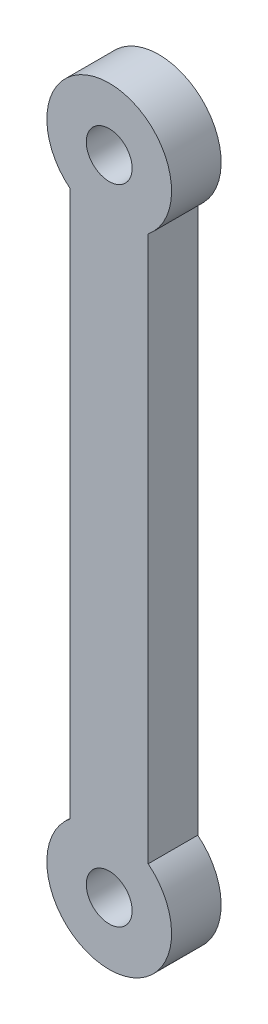
ISO-10303-21;
HEADER;
FILE_DESCRIPTION(('STEP AP214'),'2;1');
FILE_NAME('part.step','',(''),(''),'','','');
FILE_SCHEMA(('AUTOMOTIVE_DESIGN { 1 0 10303 214 1 1 1 1 }'));
ENDSEC;
DATA;
#1=APPLICATION_CONTEXT('core data for automotive mechanical design processes');
#2=APPLICATION_PROTOCOL_DEFINITION('international standard','automotive_design',2000,#1);
#3=PRODUCT_CONTEXT('',#1,'mechanical');
#4=PRODUCT('Part','Part','',(#3));
#5=PRODUCT_RELATED_PRODUCT_CATEGORY('part','',(#4));
#6=PRODUCT_DEFINITION_FORMATION('','',#4);
#7=PRODUCT_DEFINITION_CONTEXT('part definition',#1,'design');
#8=PRODUCT_DEFINITION('design','',#6,#7);
#9=PRODUCT_DEFINITION_SHAPE('','',#8);
#10=(LENGTH_UNIT() NAMED_UNIT(*) SI_UNIT(.MILLI.,.METRE.));
#11=(NAMED_UNIT(*) PLANE_ANGLE_UNIT() SI_UNIT($,.RADIAN.));
#12=(NAMED_UNIT(*) SI_UNIT($,.STERADIAN.) SOLID_ANGLE_UNIT());
#13=UNCERTAINTY_MEASURE_WITH_UNIT(LENGTH_MEASURE(1.E-05),#10,'distance_accuracy_value','');
#14=(GEOMETRIC_REPRESENTATION_CONTEXT(3) GLOBAL_UNCERTAINTY_ASSIGNED_CONTEXT((#13)) GLOBAL_UNIT_ASSIGNED_CONTEXT((#10,
#11,#12)) REPRESENTATION_CONTEXT('',''));
#15=CARTESIAN_POINT('',(0.,0.,0.));
#16=DIRECTION('',(0.,0.,1.));
#17=DIRECTION('',(1.,0.,0.));
#18=AXIS2_PLACEMENT_3D('',#15,#16,#17);
#19=CARTESIAN_POINT('',(2.5,3.1224989991992,3.18));
#20=DIRECTION('',(-1.,0.,0.));
#21=DIRECTION('',(0.,-1.,0.));
#22=AXIS2_PLACEMENT_3D('',#19,#20,#21);
#23=PLANE('',#22);
#24=DIRECTION('',(0.,1.,0.));
#25=VECTOR('',#24,1.);
#26=CARTESIAN_POINT('',(2.5,3.1224989991992,0.));
#27=LINE('',#26,#25);
#28=CARTESIAN_POINT('',(2.5,3.1224989991992,0.));
#29=VERTEX_POINT('',#28);
#30=CARTESIAN_POINT('',(2.5,38.1224989991992,0.));
#31=VERTEX_POINT('',#30);
#32=EDGE_CURVE('E87',#29,#31,#27,.T.);
#33=ORIENTED_EDGE('',*,*,#32,.T.);
#34=DIRECTION('',(0.,0.,-1.));
#35=VECTOR('',#34,1.);
#36=CARTESIAN_POINT('',(2.5,38.1224989991992,3.18));
#37=LINE('',#36,#35);
#38=CARTESIAN_POINT('',(2.5,38.1224989991992,3.18));
#39=VERTEX_POINT('',#38);
#40=EDGE_CURVE('E41',#39,#31,#37,.T.);
#41=ORIENTED_EDGE('',*,*,#40,.F.);
#42=DIRECTION('',(0.,1.,0.));
#43=VECTOR('',#42,1.);
#44=CARTESIAN_POINT('',(2.5,3.1224989991992,3.18));
#45=LINE('',#44,#43);
#46=CARTESIAN_POINT('',(2.5,3.1224989991992,3.18));
#47=VERTEX_POINT('',#46);
#48=EDGE_CURVE('E79',#47,#39,#45,.T.);
#49=ORIENTED_EDGE('',*,*,#48,.F.);
#50=DIRECTION('',(0.,0.,-1.));
#51=VECTOR('',#50,1.);
#52=CARTESIAN_POINT('',(2.5,3.1224989991992,3.18));
#53=LINE('',#52,#51);
#54=EDGE_CURVE('E11',#47,#29,#53,.T.);
#55=ORIENTED_EDGE('',*,*,#54,.T.);
#56=EDGE_LOOP('',(#33,#41,#49,#55));
#57=FACE_BOUND('',#56,.T.);
#58=ADVANCED_FACE('F33',(#57),#23,.F.);
#59=CARTESIAN_POINT('',(0.,41.2449979983984,3.18));
#60=DIRECTION('',(0.,0.,-1.));
#61=DIRECTION('',(-1.,0.,0.));
#62=AXIS2_PLACEMENT_3D('',#59,#60,#61);
#63=CYLINDRICAL_SURFACE('',#62,4.);
#64=CARTESIAN_POINT('',(0.,41.2449979983984,0.));
#65=DIRECTION('',(0.,0.,1.));
#66=DIRECTION('',(1.,0.,0.));
#67=AXIS2_PLACEMENT_3D('',#64,#65,#66);
#68=CIRCLE('',#67,4.);
#69=CARTESIAN_POINT('',(-2.5,38.1224989991992,0.));
#70=VERTEX_POINT('',#69);
#71=EDGE_CURVE('E67',#31,#70,#68,.T.);
#72=ORIENTED_EDGE('',*,*,#71,.T.);
#73=DIRECTION('',(0.,0.,-1.));
#74=VECTOR('',#73,1.);
#75=CARTESIAN_POINT('',(-2.5,38.1224989991992,3.18));
#76=LINE('',#75,#74);
#77=CARTESIAN_POINT('',(-2.5,38.1224989991992,3.18));
#78=VERTEX_POINT('',#77);
#79=EDGE_CURVE('E88',#78,#70,#76,.T.);
#80=ORIENTED_EDGE('',*,*,#79,.F.);
#81=CARTESIAN_POINT('',(0.,41.2449979983984,3.18));
#82=DIRECTION('',(0.,0.,1.));
#83=DIRECTION('',(1.,0.,0.));
#84=AXIS2_PLACEMENT_3D('',#81,#82,#83);
#85=CIRCLE('',#84,4.);
#86=EDGE_CURVE('E83',#39,#78,#85,.T.);
#87=ORIENTED_EDGE('',*,*,#86,.F.);
#88=ORIENTED_EDGE('',*,*,#40,.T.);
#89=EDGE_LOOP('',(#72,#80,#87,#88));
#90=FACE_BOUND('',#89,.T.);
#91=ADVANCED_FACE('F89',(#90),#63,.T.);
#92=CARTESIAN_POINT('',(-2.5,3.1224989991992,3.18));
#93=DIRECTION('',(1.,0.,0.));
#94=DIRECTION('',(0.,1.,0.));
#95=AXIS2_PLACEMENT_3D('',#92,#93,#94);
#96=PLANE('',#95);
#97=DIRECTION('',(0.,-1.,0.));
#98=VECTOR('',#97,1.);
#99=CARTESIAN_POINT('',(-2.5,3.1224989991992,0.));
#100=LINE('',#99,#98);
#101=CARTESIAN_POINT('',(-2.5,3.1224989991992,0.));
#102=VERTEX_POINT('',#101);
#103=EDGE_CURVE('E74',#70,#102,#100,.T.);
#104=ORIENTED_EDGE('',*,*,#103,.T.);
#105=DIRECTION('',(0.,0.,-1.));
#106=VECTOR('',#105,1.);
#107=CARTESIAN_POINT('',(-2.5,3.1224989991992,3.18));
#108=LINE('',#107,#106);
#109=CARTESIAN_POINT('',(-2.5,3.1224989991992,3.18));
#110=VERTEX_POINT('',#109);
#111=EDGE_CURVE('E93',#110,#102,#108,.T.);
#112=ORIENTED_EDGE('',*,*,#111,.F.);
#113=DIRECTION('',(0.,-1.,0.));
#114=VECTOR('',#113,1.);
#115=CARTESIAN_POINT('',(-2.5,3.1224989991992,3.18));
#116=LINE('',#115,#114);
#117=EDGE_CURVE('E91',#78,#110,#116,.T.);
#118=ORIENTED_EDGE('',*,*,#117,.F.);
#119=ORIENTED_EDGE('',*,*,#79,.T.);
#120=EDGE_LOOP('',(#104,#112,#118,#119));
#121=FACE_BOUND('',#120,.T.);
#122=ADVANCED_FACE('F104',(#121),#96,.F.);
#123=CARTESIAN_POINT('',(0.,0.,3.18));
#124=DIRECTION('',(0.,0.,-1.));
#125=DIRECTION('',(-1.,0.,0.));
#126=AXIS2_PLACEMENT_3D('',#123,#124,#125);
#127=CYLINDRICAL_SURFACE('',#126,4.);
#128=CARTESIAN_POINT('',(0.,0.,0.));
#129=DIRECTION('',(0.,0.,1.));
#130=DIRECTION('',(1.,0.,0.));
#131=AXIS2_PLACEMENT_3D('',#128,#129,#130);
#132=CIRCLE('',#131,4.);
#133=EDGE_CURVE('E101',#102,#29,#132,.T.);
#134=ORIENTED_EDGE('',*,*,#133,.T.);
#135=ORIENTED_EDGE('',*,*,#54,.F.);
#136=CARTESIAN_POINT('',(0.,0.,3.18));
#137=DIRECTION('',(0.,0.,1.));
#138=DIRECTION('',(1.,0.,0.));
#139=AXIS2_PLACEMENT_3D('',#136,#137,#138);
#140=CIRCLE('',#139,4.);
#141=EDGE_CURVE('E49',#110,#47,#140,.T.);
#142=ORIENTED_EDGE('',*,*,#141,.F.);
#143=ORIENTED_EDGE('',*,*,#111,.T.);
#144=EDGE_LOOP('',(#134,#135,#142,#143));
#145=FACE_BOUND('',#144,.T.);
#146=ADVANCED_FACE('F108',(#145),#127,.T.);
#147=CARTESIAN_POINT('',(0.,0.,3.18));
#148=DIRECTION('',(0.,0.,1.));
#149=DIRECTION('',(1.,0.,0.));
#150=AXIS2_PLACEMENT_3D('',#147,#148,#149);
#151=PLANE('',#150);
#152=CARTESIAN_POINT('',(0.,41.2449979983984,3.18));
#153=DIRECTION('',(0.,0.,1.));
#154=DIRECTION('',(1.,0.,0.));
#155=AXIS2_PLACEMENT_3D('',#152,#153,#154);
#156=CIRCLE('',#155,1.47);
#157=CARTESIAN_POINT('',(1.47,41.2449979983984,3.18));
#158=VERTEX_POINT('',#157);
#159=EDGE_CURVE('E178',#158,#158,#156,.T.);
#160=ORIENTED_EDGE('',*,*,#159,.F.);
#161=EDGE_LOOP('',(#160));
#162=FACE_BOUND('',#161,.T.);
#163=CARTESIAN_POINT('',(0.,0.,3.18));
#164=DIRECTION('',(0.,0.,1.));
#165=DIRECTION('',(1.,0.,0.));
#166=AXIS2_PLACEMENT_3D('',#163,#164,#165);
#167=CIRCLE('',#166,1.47);
#168=CARTESIAN_POINT('',(1.47,0.,3.18));
#169=VERTEX_POINT('',#168);
#170=EDGE_CURVE('E183',#169,#169,#167,.T.);
#171=ORIENTED_EDGE('',*,*,#170,.F.);
#172=EDGE_LOOP('',(#171));
#173=FACE_BOUND('',#172,.T.);
#174=ORIENTED_EDGE('',*,*,#141,.T.);
#175=ORIENTED_EDGE('',*,*,#48,.T.);
#176=ORIENTED_EDGE('',*,*,#86,.T.);
#177=ORIENTED_EDGE('',*,*,#117,.T.);
#178=EDGE_LOOP('',(#174,#175,#176,#177));
#179=FACE_BOUND('',#178,.T.);
#180=ADVANCED_FACE('F81',(#162,#173,#179),#151,.T.);
#181=CARTESIAN_POINT('',(0.,0.,0.));
#182=DIRECTION('',(0.,0.,1.));
#183=DIRECTION('',(1.,0.,0.));
#184=AXIS2_PLACEMENT_3D('',#181,#182,#183);
#185=PLANE('',#184);
#186=CARTESIAN_POINT('',(0.,41.2449979983984,0.));
#187=DIRECTION('',(0.,0.,1.));
#188=DIRECTION('',(1.,0.,0.));
#189=AXIS2_PLACEMENT_3D('',#186,#187,#188);
#190=CIRCLE('',#189,1.47);
#191=CARTESIAN_POINT('',(1.47,41.2449979983984,0.));
#192=VERTEX_POINT('',#191);
#193=EDGE_CURVE('E98',#192,#192,#190,.T.);
#194=ORIENTED_EDGE('',*,*,#193,.T.);
#195=EDGE_LOOP('',(#194));
#196=FACE_BOUND('',#195,.T.);
#197=CARTESIAN_POINT('',(0.,0.,0.));
#198=DIRECTION('',(0.,0.,1.));
#199=DIRECTION('',(1.,0.,0.));
#200=AXIS2_PLACEMENT_3D('',#197,#198,#199);
#201=CIRCLE('',#200,1.47);
#202=CARTESIAN_POINT('',(1.47,0.,0.));
#203=VERTEX_POINT('',#202);
#204=EDGE_CURVE('E179',#203,#203,#201,.T.);
#205=ORIENTED_EDGE('',*,*,#204,.T.);
#206=EDGE_LOOP('',(#205));
#207=FACE_BOUND('',#206,.T.);
#208=ORIENTED_EDGE('',*,*,#32,.F.);
#209=ORIENTED_EDGE('',*,*,#133,.F.);
#210=ORIENTED_EDGE('',*,*,#103,.F.);
#211=ORIENTED_EDGE('',*,*,#71,.F.);
#212=EDGE_LOOP('',(#208,#209,#210,#211));
#213=FACE_BOUND('',#212,.T.);
#214=ADVANCED_FACE('F107',(#196,#207,#213),#185,.F.);
#215=CARTESIAN_POINT('',(0.,0.,0.));
#216=DIRECTION('',(0.,0.,1.));
#217=DIRECTION('',(1.,0.,0.));
#218=AXIS2_PLACEMENT_3D('',#215,#216,#217);
#219=CYLINDRICAL_SURFACE('',#218,1.47);
#220=CARTESIAN_POINT('',(1.47,0.,0.));
#221=CARTESIAN_POINT('',(1.47,0.,0.033125));
#222=CARTESIAN_POINT('',(1.47,0.,0.06625));
#223=CARTESIAN_POINT('',(1.47,0.,0.1325));
#224=CARTESIAN_POINT('',(1.47,0.,0.165625));
#225=CARTESIAN_POINT('',(1.47,0.,0.231875));
#226=CARTESIAN_POINT('',(1.47,0.,0.265));
#227=CARTESIAN_POINT('',(1.47,0.,0.33125));
#228=CARTESIAN_POINT('',(1.47,0.,0.364375));
#229=CARTESIAN_POINT('',(1.47,0.,0.430625));
#230=CARTESIAN_POINT('',(1.47,0.,0.46375));
#231=CARTESIAN_POINT('',(1.47,0.,0.53));
#232=CARTESIAN_POINT('',(1.47,0.,0.563125));
#233=CARTESIAN_POINT('',(1.47,0.,0.629375));
#234=CARTESIAN_POINT('',(1.47,0.,0.6625));
#235=CARTESIAN_POINT('',(1.47,0.,0.72875));
#236=CARTESIAN_POINT('',(1.47,0.,0.761875));
#237=CARTESIAN_POINT('',(1.47,0.,0.828125));
#238=CARTESIAN_POINT('',(1.47,0.,0.86125));
#239=CARTESIAN_POINT('',(1.47,0.,0.9275));
#240=CARTESIAN_POINT('',(1.47,0.,0.960625));
#241=CARTESIAN_POINT('',(1.47,0.,1.026875));
#242=CARTESIAN_POINT('',(1.47,0.,1.06));
#243=CARTESIAN_POINT('',(1.47,0.,1.12625));
#244=CARTESIAN_POINT('',(1.47,0.,1.159375));
#245=CARTESIAN_POINT('',(1.47,0.,1.225625));
#246=CARTESIAN_POINT('',(1.47,0.,1.25875));
#247=CARTESIAN_POINT('',(1.47,0.,1.325));
#248=CARTESIAN_POINT('',(1.47,0.,1.358125));
#249=CARTESIAN_POINT('',(1.47,0.,1.424375));
#250=CARTESIAN_POINT('',(1.47,0.,1.4575));
#251=CARTESIAN_POINT('',(1.47,0.,1.52375));
#252=CARTESIAN_POINT('',(1.47,0.,1.556875));
#253=CARTESIAN_POINT('',(1.47,0.,1.623125));
#254=CARTESIAN_POINT('',(1.47,0.,1.65625));
#255=CARTESIAN_POINT('',(1.47,0.,1.7225));
#256=CARTESIAN_POINT('',(1.47,0.,1.755625));
#257=CARTESIAN_POINT('',(1.47,0.,1.821875));
#258=CARTESIAN_POINT('',(1.47,0.,1.855));
#259=CARTESIAN_POINT('',(1.47,0.,1.92125));
#260=CARTESIAN_POINT('',(1.47,0.,1.954375));
#261=CARTESIAN_POINT('',(1.47,0.,2.020625));
#262=CARTESIAN_POINT('',(1.47,0.,2.05375));
#263=CARTESIAN_POINT('',(1.47,0.,2.12));
#264=CARTESIAN_POINT('',(1.47,0.,2.153125));
#265=CARTESIAN_POINT('',(1.47,0.,2.219375));
#266=CARTESIAN_POINT('',(1.47,0.,2.2525));
#267=CARTESIAN_POINT('',(1.47,0.,2.31875));
#268=CARTESIAN_POINT('',(1.47,0.,2.351875));
#269=CARTESIAN_POINT('',(1.47,0.,2.418125));
#270=CARTESIAN_POINT('',(1.47,0.,2.45125));
#271=CARTESIAN_POINT('',(1.47,0.,2.5175));
#272=CARTESIAN_POINT('',(1.47,0.,2.550625));
#273=CARTESIAN_POINT('',(1.47,0.,2.616875));
#274=CARTESIAN_POINT('',(1.47,0.,2.65));
#275=CARTESIAN_POINT('',(1.47,0.,2.71625));
#276=CARTESIAN_POINT('',(1.47,0.,2.749375));
#277=CARTESIAN_POINT('',(1.47,0.,2.815625));
#278=CARTESIAN_POINT('',(1.47,0.,2.84875));
#279=CARTESIAN_POINT('',(1.47,0.,2.915));
#280=CARTESIAN_POINT('',(1.47,0.,2.948125));
#281=CARTESIAN_POINT('',(1.47,0.,3.014375));
#282=CARTESIAN_POINT('',(1.47,0.,3.0475));
#283=CARTESIAN_POINT('',(1.47,0.,3.11375));
#284=CARTESIAN_POINT('',(1.47,0.,3.146875));
#285=CARTESIAN_POINT('',(1.47,0.,3.18));
#286=B_SPLINE_CURVE_WITH_KNOTS('',3,(#220,#221,#222,#223,#224,#225,#226,#227,#228,#229,#230,
#231,#232,#233,#234,#235,#236,#237,#238,#239,#240,#241,#242,#243,#244,#245,#246,#247,#248,#249,
#250,#251,#252,#253,#254,#255,#256,#257,#258,#259,#260,#261,#262,#263,#264,#265,#266,#267,#268,
#269,#270,#271,#272,#273,#274,#275,#276,#277,#278,#279,#280,#281,#282,#283,#284,#285),
.UNSPECIFIED.,.F.,.F.,(4,2,2,2,2,2,2,2,2,2,2,2,2,2,2,2,2,2,2,2,2,2,2,2,2,2,2,2,2,2,2,2,4),(0.,
0.099375,0.19875,0.298125,0.3975,0.496875,0.59625,0.695625,0.795,0.894375,0.99375,1.093125,
1.1925,1.291875,1.39125,1.490625,1.59,1.689375,1.78875,1.888125,1.9875,2.086875,2.18625,
2.285625,2.385,2.484375,2.58375,2.683125,2.7825,2.881875,2.98125,3.080625,3.18),.UNSPECIFIED.);
#287=EDGE_CURVE('BSEAM150',#203,#169,#286,.T.);
#288=ORIENTED_EDGE('',*,*,#204,.F.);
#289=ORIENTED_EDGE('',*,*,#170,.T.);
#290=ORIENTED_EDGE('',*,*,#287,.T.);
#291=ORIENTED_EDGE('',*,*,#287,.F.);
#292=EDGE_LOOP('',(#288,#290,#289,#291));
#293=FACE_BOUND('',#292,.T.);
#294=ADVANCED_FACE('F150',(#293),#219,.F.);
#295=CARTESIAN_POINT('',(0.,41.2449979983984,0.));
#296=DIRECTION('',(0.,0.,1.));
#297=DIRECTION('',(1.,0.,0.));
#298=AXIS2_PLACEMENT_3D('',#295,#296,#297);
#299=CYLINDRICAL_SURFACE('',#298,1.47);
#300=CARTESIAN_POINT('',(1.47,41.2449979983984,0.));
#301=CARTESIAN_POINT('',(1.47,41.2449979983984,0.033125));
#302=CARTESIAN_POINT('',(1.47,41.2449979983984,0.06625));
#303=CARTESIAN_POINT('',(1.47,41.2449979983984,0.1325));
#304=CARTESIAN_POINT('',(1.47,41.2449979983984,0.165625));
#305=CARTESIAN_POINT('',(1.47,41.2449979983984,0.231875));
#306=CARTESIAN_POINT('',(1.47,41.2449979983984,0.265));
#307=CARTESIAN_POINT('',(1.47,41.2449979983984,0.33125));
#308=CARTESIAN_POINT('',(1.47,41.2449979983984,0.364375));
#309=CARTESIAN_POINT('',(1.47,41.2449979983984,0.430625));
#310=CARTESIAN_POINT('',(1.47,41.2449979983984,0.46375));
#311=CARTESIAN_POINT('',(1.47,41.2449979983984,0.53));
#312=CARTESIAN_POINT('',(1.47,41.2449979983984,0.563125));
#313=CARTESIAN_POINT('',(1.47,41.2449979983984,0.629375));
#314=CARTESIAN_POINT('',(1.47,41.2449979983984,0.6625));
#315=CARTESIAN_POINT('',(1.47,41.2449979983984,0.72875));
#316=CARTESIAN_POINT('',(1.47,41.2449979983984,0.761875));
#317=CARTESIAN_POINT('',(1.47,41.2449979983984,0.828125));
#318=CARTESIAN_POINT('',(1.47,41.2449979983984,0.86125));
#319=CARTESIAN_POINT('',(1.47,41.2449979983984,0.9275));
#320=CARTESIAN_POINT('',(1.47,41.2449979983984,0.960625));
#321=CARTESIAN_POINT('',(1.47,41.2449979983984,1.026875));
#322=CARTESIAN_POINT('',(1.47,41.2449979983984,1.06));
#323=CARTESIAN_POINT('',(1.47,41.2449979983984,1.12625));
#324=CARTESIAN_POINT('',(1.47,41.2449979983984,1.159375));
#325=CARTESIAN_POINT('',(1.47,41.2449979983984,1.225625));
#326=CARTESIAN_POINT('',(1.47,41.2449979983984,1.25875));
#327=CARTESIAN_POINT('',(1.47,41.2449979983984,1.325));
#328=CARTESIAN_POINT('',(1.47,41.2449979983984,1.358125));
#329=CARTESIAN_POINT('',(1.47,41.2449979983984,1.424375));
#330=CARTESIAN_POINT('',(1.47,41.2449979983984,1.4575));
#331=CARTESIAN_POINT('',(1.47,41.2449979983984,1.52375));
#332=CARTESIAN_POINT('',(1.47,41.2449979983984,1.556875));
#333=CARTESIAN_POINT('',(1.47,41.2449979983984,1.623125));
#334=CARTESIAN_POINT('',(1.47,41.2449979983984,1.65625));
#335=CARTESIAN_POINT('',(1.47,41.2449979983984,1.7225));
#336=CARTESIAN_POINT('',(1.47,41.2449979983984,1.755625));
#337=CARTESIAN_POINT('',(1.47,41.2449979983984,1.821875));
#338=CARTESIAN_POINT('',(1.47,41.2449979983984,1.855));
#339=CARTESIAN_POINT('',(1.47,41.2449979983984,1.92125));
#340=CARTESIAN_POINT('',(1.47,41.2449979983984,1.954375));
#341=CARTESIAN_POINT('',(1.47,41.2449979983984,2.020625));
#342=CARTESIAN_POINT('',(1.47,41.2449979983984,2.05375));
#343=CARTESIAN_POINT('',(1.47,41.2449979983984,2.12));
#344=CARTESIAN_POINT('',(1.47,41.2449979983984,2.153125));
#345=CARTESIAN_POINT('',(1.47,41.2449979983984,2.219375));
#346=CARTESIAN_POINT('',(1.47,41.2449979983984,2.2525));
#347=CARTESIAN_POINT('',(1.47,41.2449979983984,2.31875));
#348=CARTESIAN_POINT('',(1.47,41.2449979983984,2.351875));
#349=CARTESIAN_POINT('',(1.47,41.2449979983984,2.418125));
#350=CARTESIAN_POINT('',(1.47,41.2449979983984,2.45125));
#351=CARTESIAN_POINT('',(1.47,41.2449979983984,2.5175));
#352=CARTESIAN_POINT('',(1.47,41.2449979983984,2.550625));
#353=CARTESIAN_POINT('',(1.47,41.2449979983984,2.616875));
#354=CARTESIAN_POINT('',(1.47,41.2449979983984,2.65));
#355=CARTESIAN_POINT('',(1.47,41.2449979983984,2.71625));
#356=CARTESIAN_POINT('',(1.47,41.2449979983984,2.749375));
#357=CARTESIAN_POINT('',(1.47,41.2449979983984,2.815625));
#358=CARTESIAN_POINT('',(1.47,41.2449979983984,2.84875));
#359=CARTESIAN_POINT('',(1.47,41.2449979983984,2.915));
#360=CARTESIAN_POINT('',(1.47,41.2449979983984,2.948125));
#361=CARTESIAN_POINT('',(1.47,41.2449979983984,3.014375));
#362=CARTESIAN_POINT('',(1.47,41.2449979983984,3.0475));
#363=CARTESIAN_POINT('',(1.47,41.2449979983984,3.11375));
#364=CARTESIAN_POINT('',(1.47,41.2449979983984,3.146875));
#365=CARTESIAN_POINT('',(1.47,41.2449979983984,3.18));
#366=B_SPLINE_CURVE_WITH_KNOTS('',3,(#300,#301,#302,#303,#304,#305,#306,#307,#308,#309,#310,
#311,#312,#313,#314,#315,#316,#317,#318,#319,#320,#321,#322,#323,#324,#325,#326,#327,#328,#329,
#330,#331,#332,#333,#334,#335,#336,#337,#338,#339,#340,#341,#342,#343,#344,#345,#346,#347,#348,
#349,#350,#351,#352,#353,#354,#355,#356,#357,#358,#359,#360,#361,#362,#363,#364,#365),
.UNSPECIFIED.,.F.,.F.,(4,2,2,2,2,2,2,2,2,2,2,2,2,2,2,2,2,2,2,2,2,2,2,2,2,2,2,2,2,2,2,2,4),(0.,
0.099375,0.19875,0.298125,0.3975,0.496875,0.59625,0.695625,0.795,0.894375,0.99375,1.093125,
1.1925,1.291875,1.39125,1.490625,1.59,1.689375,1.78875,1.888125,1.9875,2.086875,2.18625,
2.285625,2.385,2.484375,2.58375,2.683125,2.7825,2.881875,2.98125,3.080625,3.18),.UNSPECIFIED.);
#367=EDGE_CURVE('BSEAM159',#192,#158,#366,.T.);
#368=ORIENTED_EDGE('',*,*,#193,.F.);
#369=ORIENTED_EDGE('',*,*,#159,.T.);
#370=ORIENTED_EDGE('',*,*,#367,.T.);
#371=ORIENTED_EDGE('',*,*,#367,.F.);
#372=EDGE_LOOP('',(#368,#370,#369,#371));
#373=FACE_BOUND('',#372,.T.);
#374=ADVANCED_FACE('F159',(#373),#299,.F.);
#375=CLOSED_SHELL('',(#58,#91,#122,#146,#180,#214,#294,#374));
#376=MANIFOLD_SOLID_BREP('B2',#375);
#377=ADVANCED_BREP_SHAPE_REPRESENTATION('',(#18,#376),#14);
#378=SHAPE_DEFINITION_REPRESENTATION(#9,#377);
ENDSEC;
END-ISO-10303-21;
